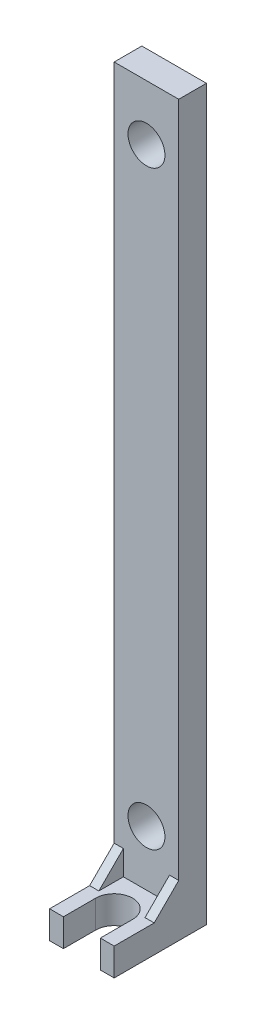
ISO-10303-21;
HEADER;
FILE_DESCRIPTION(('STEP AP214'),'2;1');
FILE_NAME('part.step','',(''),(''),'','','');
FILE_SCHEMA(('AUTOMOTIVE_DESIGN { 1 0 10303 214 1 1 1 1 }'));
ENDSEC;
DATA;
#1=APPLICATION_CONTEXT('core data for automotive mechanical design processes');
#2=APPLICATION_PROTOCOL_DEFINITION('international standard','automotive_design',2000,#1);
#3=PRODUCT_CONTEXT('',#1,'mechanical');
#4=PRODUCT('Part','Part','',(#3));
#5=PRODUCT_RELATED_PRODUCT_CATEGORY('part','',(#4));
#6=PRODUCT_DEFINITION_FORMATION('','',#4);
#7=PRODUCT_DEFINITION_CONTEXT('part definition',#1,'design');
#8=PRODUCT_DEFINITION('design','',#6,#7);
#9=PRODUCT_DEFINITION_SHAPE('','',#8);
#10=(LENGTH_UNIT() NAMED_UNIT(*) SI_UNIT(.MILLI.,.METRE.));
#11=(NAMED_UNIT(*) PLANE_ANGLE_UNIT() SI_UNIT($,.RADIAN.));
#12=(NAMED_UNIT(*) SI_UNIT($,.STERADIAN.) SOLID_ANGLE_UNIT());
#13=UNCERTAINTY_MEASURE_WITH_UNIT(LENGTH_MEASURE(1.E-05),#10,'distance_accuracy_value','');
#14=(GEOMETRIC_REPRESENTATION_CONTEXT(3) GLOBAL_UNCERTAINTY_ASSIGNED_CONTEXT((#13)) GLOBAL_UNIT_ASSIGNED_CONTEXT((#10,
#11,#12)) REPRESENTATION_CONTEXT('',''));
#15=CARTESIAN_POINT('',(0.,0.,0.));
#16=DIRECTION('',(0.,0.,1.));
#17=DIRECTION('',(1.,0.,0.));
#18=AXIS2_PLACEMENT_3D('',#15,#16,#17);
#19=CARTESIAN_POINT('',(0.,0.,3.));
#20=DIRECTION('',(0.,0.,1.));
#21=DIRECTION('',(1.,0.,0.));
#22=AXIS2_PLACEMENT_3D('',#19,#20,#21);
#23=PLANE('',#22);
#24=CARTESIAN_POINT('',(0.,33.5,3.));
#25=DIRECTION('',(0.,0.,1.));
#26=DIRECTION('',(1.,0.,0.));
#27=AXIS2_PLACEMENT_3D('',#24,#25,#26);
#28=CIRCLE('',#27,2.);
#29=CARTESIAN_POINT('',(2.,33.5,3.));
#30=VERTEX_POINT('',#29);
#31=EDGE_CURVE('E208',#30,#30,#28,.T.);
#32=ORIENTED_EDGE('',*,*,#31,.F.);
#33=EDGE_LOOP('',(#32));
#34=FACE_BOUND('',#33,.T.);
#35=CARTESIAN_POINT('',(0.,-30.5,3.));
#36=DIRECTION('',(0.,0.,1.));
#37=DIRECTION('',(1.,0.,0.));
#38=AXIS2_PLACEMENT_3D('',#35,#36,#37);
#39=CIRCLE('',#38,2.);
#40=CARTESIAN_POINT('',(2.,-30.5,3.));
#41=VERTEX_POINT('',#40);
#42=EDGE_CURVE('E232',#41,#41,#39,.T.);
#43=ORIENTED_EDGE('',*,*,#42,.F.);
#44=EDGE_LOOP('',(#43));
#45=FACE_BOUND('',#44,.T.);
#46=DIRECTION('',(0.,-1.,0.));
#47=VECTOR('',#46,1.);
#48=CARTESIAN_POINT('',(2.5,-33.8394874638918,3.));
#49=LINE('',#48,#47);
#50=CARTESIAN_POINT('',(2.5,-33.8394874638918,3.));
#51=VERTEX_POINT('',#50);
#52=CARTESIAN_POINT('',(2.5,-36.5,3.));
#53=VERTEX_POINT('',#52);
#54=EDGE_CURVE('E51',#51,#53,#49,.T.);
#55=ORIENTED_EDGE('',*,*,#54,.F.);
#56=DIRECTION('',(1.,0.,0.));
#57=VECTOR('',#56,1.);
#58=CARTESIAN_POINT('',(2.5,-33.8394874638918,3.));
#59=LINE('',#58,#57);
#60=CARTESIAN_POINT('',(3.5,-33.8394874638918,3.));
#61=VERTEX_POINT('',#60);
#62=EDGE_CURVE('E56',#51,#61,#59,.T.);
#63=ORIENTED_EDGE('',*,*,#62,.T.);
#64=DIRECTION('',(0.,1.,0.));
#65=VECTOR('',#64,1.);
#66=CARTESIAN_POINT('',(3.5,39.5,3.));
#67=LINE('',#66,#65);
#68=CARTESIAN_POINT('',(3.5,39.5,3.));
#69=VERTEX_POINT('',#68);
#70=EDGE_CURVE('E37',#61,#69,#67,.T.);
#71=ORIENTED_EDGE('',*,*,#70,.T.);
#72=DIRECTION('',(-1.,0.,0.));
#73=VECTOR('',#72,1.);
#74=CARTESIAN_POINT('',(-3.50000000000001,39.5,3.));
#75=LINE('',#74,#73);
#76=CARTESIAN_POINT('',(-3.50000000000001,39.5,3.));
#77=VERTEX_POINT('',#76);
#78=EDGE_CURVE('E223',#69,#77,#75,.T.);
#79=ORIENTED_EDGE('',*,*,#78,.T.);
#80=DIRECTION('',(0.,-1.,0.));
#81=VECTOR('',#80,1.);
#82=CARTESIAN_POINT('',(-3.50000000000001,39.5,3.));
#83=LINE('',#82,#81);
#84=CARTESIAN_POINT('',(-3.5,-33.8394874638918,3.));
#85=VERTEX_POINT('',#84);
#86=EDGE_CURVE('E220',#77,#85,#83,.T.);
#87=ORIENTED_EDGE('',*,*,#86,.T.);
#88=DIRECTION('',(-1.,0.,0.));
#89=VECTOR('',#88,1.);
#90=CARTESIAN_POINT('',(-2.5,-33.8394874638918,3.));
#91=LINE('',#90,#89);
#92=CARTESIAN_POINT('',(-2.5,-33.8394874638918,3.));
#93=VERTEX_POINT('',#92);
#94=EDGE_CURVE('E155',#93,#85,#91,.T.);
#95=ORIENTED_EDGE('',*,*,#94,.F.);
#96=DIRECTION('',(0.,-1.,0.));
#97=VECTOR('',#96,1.);
#98=CARTESIAN_POINT('',(-2.5,-33.8394874638918,3.));
#99=LINE('',#98,#97);
#100=CARTESIAN_POINT('',(-2.5,-36.5,3.));
#101=VERTEX_POINT('',#100);
#102=EDGE_CURVE('E149',#93,#101,#99,.T.);
#103=ORIENTED_EDGE('',*,*,#102,.T.);
#104=DIRECTION('',(-1.,0.,0.));
#105=VECTOR('',#104,1.);
#106=CARTESIAN_POINT('',(-3.50000000000001,-36.5,3.));
#107=LINE('',#106,#105);
#108=EDGE_CURVE('E136',#53,#101,#107,.T.);
#109=ORIENTED_EDGE('',*,*,#108,.F.);
#110=EDGE_LOOP('',(#55,#63,#71,#79,#87,#95,#103,#109));
#111=FACE_BOUND('',#110,.T.);
#112=ADVANCED_FACE('F33',(#34,#45,#111),#23,.T.);
#113=CARTESIAN_POINT('',(-3.50000000000001,-36.5,10.));
#114=DIRECTION('',(0.,-1.,0.));
#115=DIRECTION('',(0.,0.,-1.));
#116=AXIS2_PLACEMENT_3D('',#113,#114,#115);
#117=PLANE('',#116);
#118=DIRECTION('',(1.,0.,0.));
#119=VECTOR('',#118,1.);
#120=CARTESIAN_POINT('',(2.5,-36.5,5.66051253610824));
#121=LINE('',#120,#119);
#122=CARTESIAN_POINT('',(2.5,-36.5,5.66051253610824));
#123=VERTEX_POINT('',#122);
#124=CARTESIAN_POINT('',(3.50000000000001,-36.5,5.66051253610824));
#125=VERTEX_POINT('',#124);
#126=EDGE_CURVE('E159',#123,#125,#121,.T.);
#127=ORIENTED_EDGE('',*,*,#126,.F.);
#128=DIRECTION('',(0.,0.,1.));
#129=VECTOR('',#128,1.);
#130=CARTESIAN_POINT('',(2.5,-36.5,3.));
#131=LINE('',#130,#129);
#132=EDGE_CURVE('E142',#53,#123,#131,.T.);
#133=ORIENTED_EDGE('',*,*,#132,.F.);
#134=ORIENTED_EDGE('',*,*,#108,.T.);
#135=DIRECTION('',(0.,0.,1.));
#136=VECTOR('',#135,1.);
#137=CARTESIAN_POINT('',(-2.5,-36.5,3.));
#138=LINE('',#137,#136);
#139=CARTESIAN_POINT('',(-2.5,-36.5,5.66051253610824));
#140=VERTEX_POINT('',#139);
#141=EDGE_CURVE('E140',#101,#140,#138,.T.);
#142=ORIENTED_EDGE('',*,*,#141,.T.);
#143=DIRECTION('',(-1.,0.,0.));
#144=VECTOR('',#143,1.);
#145=CARTESIAN_POINT('',(-2.5,-36.5,5.66051253610824));
#146=LINE('',#145,#144);
#147=CARTESIAN_POINT('',(-3.5,-36.5,5.66051253610824));
#148=VERTEX_POINT('',#147);
#149=EDGE_CURVE('E164',#140,#148,#146,.T.);
#150=ORIENTED_EDGE('',*,*,#149,.T.);
#151=DIRECTION('',(0.,0.,-1.));
#152=VECTOR('',#151,1.);
#153=CARTESIAN_POINT('',(-3.50000000000001,-36.5,10.));
#154=LINE('',#153,#152);
#155=CARTESIAN_POINT('',(-3.50000000000001,-36.5,10.));
#156=VERTEX_POINT('',#155);
#157=EDGE_CURVE('E205',#156,#148,#154,.T.);
#158=ORIENTED_EDGE('',*,*,#157,.F.);
#159=DIRECTION('',(-1.,0.,0.));
#160=VECTOR('',#159,1.);
#161=CARTESIAN_POINT('',(-3.50000000000001,-36.5,10.));
#162=LINE('',#161,#160);
#163=CARTESIAN_POINT('',(-2.,-36.5,10.));
#164=VERTEX_POINT('',#163);
#165=EDGE_CURVE('E194',#164,#156,#162,.T.);
#166=ORIENTED_EDGE('',*,*,#165,.F.);
#167=DIRECTION('',(0.,0.,1.));
#168=VECTOR('',#167,1.);
#169=CARTESIAN_POINT('',(-2.,-36.5,6.5));
#170=LINE('',#169,#168);
#171=CARTESIAN_POINT('',(-2.,-36.5,6.5));
#172=VERTEX_POINT('',#171);
#173=EDGE_CURVE('E171',#172,#164,#170,.T.);
#174=ORIENTED_EDGE('',*,*,#173,.F.);
#175=CARTESIAN_POINT('',(0.,-36.5,6.5));
#176=DIRECTION('',(0.,-1.,0.));
#177=DIRECTION('',(0.,0.,-1.));
#178=AXIS2_PLACEMENT_3D('',#175,#176,#177);
#179=CIRCLE('',#178,2.);
#180=CARTESIAN_POINT('',(2.,-36.5,6.5));
#181=VERTEX_POINT('',#180);
#182=EDGE_CURVE('E167',#181,#172,#179,.F.);
#183=ORIENTED_EDGE('',*,*,#182,.F.);
#184=DIRECTION('',(0.,0.,-1.));
#185=VECTOR('',#184,1.);
#186=CARTESIAN_POINT('',(2.,-36.5,6.5));
#187=LINE('',#186,#185);
#188=CARTESIAN_POINT('',(2.,-36.5,10.));
#189=VERTEX_POINT('',#188);
#190=EDGE_CURVE('E145',#189,#181,#187,.T.);
#191=ORIENTED_EDGE('',*,*,#190,.F.);
#192=CARTESIAN_POINT('',(3.50000000000001,-36.5,10.));
#193=VERTEX_POINT('',#192);
#194=EDGE_CURVE('E195',#193,#189,#162,.T.);
#195=ORIENTED_EDGE('',*,*,#194,.F.);
#196=DIRECTION('',(0.,0.,-1.));
#197=VECTOR('',#196,1.);
#198=CARTESIAN_POINT('',(3.50000000000001,-36.5,10.));
#199=LINE('',#198,#197);
#200=EDGE_CURVE('E213',#193,#125,#199,.T.);
#201=ORIENTED_EDGE('',*,*,#200,.T.);
#202=EDGE_LOOP('',(#127,#133,#134,#142,#150,#158,#166,#174,#183,#191,#195,#201));
#203=FACE_BOUND('',#202,.T.);
#204=ADVANCED_FACE('F138',(#203),#117,.F.);
#205=CARTESIAN_POINT('',(0.,0.,10.));
#206=DIRECTION('',(0.,0.,1.));
#207=DIRECTION('',(1.,0.,0.));
#208=AXIS2_PLACEMENT_3D('',#205,#206,#207);
#209=PLANE('',#208);
#210=DIRECTION('',(0.,-1.,0.));
#211=VECTOR('',#210,1.);
#212=CARTESIAN_POINT('',(-2.,39.501025,10.));
#213=LINE('',#212,#211);
#214=CARTESIAN_POINT('',(-2.,-39.5,10.));
#215=VERTEX_POINT('',#214);
#216=EDGE_CURVE('E184',#164,#215,#213,.T.);
#217=ORIENTED_EDGE('',*,*,#216,.F.);
#218=ORIENTED_EDGE('',*,*,#165,.T.);
#219=DIRECTION('',(0.,-1.,0.));
#220=VECTOR('',#219,1.);
#221=CARTESIAN_POINT('',(-3.50000000000001,-36.5,10.));
#222=LINE('',#221,#220);
#223=CARTESIAN_POINT('',(-3.50000000000001,-39.5,10.));
#224=VERTEX_POINT('',#223);
#225=EDGE_CURVE('E198',#156,#224,#222,.T.);
#226=ORIENTED_EDGE('',*,*,#225,.T.);
#227=DIRECTION('',(1.,0.,0.));
#228=VECTOR('',#227,1.);
#229=CARTESIAN_POINT('',(-3.50000000000001,-39.5,10.));
#230=LINE('',#229,#228);
#231=EDGE_CURVE('E202',#224,#215,#230,.T.);
#232=ORIENTED_EDGE('',*,*,#231,.T.);
#233=EDGE_LOOP('',(#217,#218,#226,#232));
#234=FACE_BOUND('',#233,.T.);
#235=ADVANCED_FACE('F281',(#234),#209,.T.);
#236=CARTESIAN_POINT('',(0.,0.,0.));
#237=DIRECTION('',(0.,0.,1.));
#238=DIRECTION('',(1.,0.,0.));
#239=AXIS2_PLACEMENT_3D('',#236,#237,#238);
#240=PLANE('',#239);
#241=CARTESIAN_POINT('',(0.,-30.5,0.));
#242=DIRECTION('',(0.,0.,1.));
#243=DIRECTION('',(1.,0.,0.));
#244=AXIS2_PLACEMENT_3D('',#241,#242,#243);
#245=CIRCLE('',#244,2.);
#246=CARTESIAN_POINT('',(2.,-30.5,0.));
#247=VERTEX_POINT('',#246);
#248=EDGE_CURVE('E462',#247,#247,#245,.T.);
#249=ORIENTED_EDGE('',*,*,#248,.T.);
#250=EDGE_LOOP('',(#249));
#251=FACE_BOUND('',#250,.T.);
#252=DIRECTION('',(0.,1.,0.));
#253=VECTOR('',#252,1.);
#254=CARTESIAN_POINT('',(3.5,39.5,0.));
#255=LINE('',#254,#253);
#256=CARTESIAN_POINT('',(3.50000000000001,-39.5,0.));
#257=VERTEX_POINT('',#256);
#258=CARTESIAN_POINT('',(3.5,39.5,0.));
#259=VERTEX_POINT('',#258);
#260=EDGE_CURVE('E228',#257,#259,#255,.T.);
#261=ORIENTED_EDGE('',*,*,#260,.F.);
#262=DIRECTION('',(1.,0.,0.));
#263=VECTOR('',#262,1.);
#264=CARTESIAN_POINT('',(-3.5,-39.5,0.));
#265=LINE('',#264,#263);
#266=CARTESIAN_POINT('',(-3.5,-39.5,0.));
#267=VERTEX_POINT('',#266);
#268=EDGE_CURVE('E236',#267,#257,#265,.T.);
#269=ORIENTED_EDGE('',*,*,#268,.F.);
#270=DIRECTION('',(0.,-1.,0.));
#271=VECTOR('',#270,1.);
#272=CARTESIAN_POINT('',(-3.50000000000001,39.5,0.));
#273=LINE('',#272,#271);
#274=CARTESIAN_POINT('',(-3.50000000000001,39.5,0.));
#275=VERTEX_POINT('',#274);
#276=EDGE_CURVE('E234',#275,#267,#273,.T.);
#277=ORIENTED_EDGE('',*,*,#276,.F.);
#278=DIRECTION('',(-1.,0.,0.));
#279=VECTOR('',#278,1.);
#280=CARTESIAN_POINT('',(-3.50000000000001,39.5,0.));
#281=LINE('',#280,#279);
#282=EDGE_CURVE('E231',#259,#275,#281,.T.);
#283=ORIENTED_EDGE('',*,*,#282,.F.);
#284=EDGE_LOOP('',(#261,#269,#277,#283));
#285=FACE_BOUND('',#284,.T.);
#286=CARTESIAN_POINT('',(0.,33.5,0.));
#287=DIRECTION('',(0.,0.,1.));
#288=DIRECTION('',(1.,0.,0.));
#289=AXIS2_PLACEMENT_3D('',#286,#287,#288);
#290=CIRCLE('',#289,2.);
#291=CARTESIAN_POINT('',(2.,33.5,0.));
#292=VERTEX_POINT('',#291);
#293=EDGE_CURVE('E215',#292,#292,#290,.T.);
#294=ORIENTED_EDGE('',*,*,#293,.T.);
#295=EDGE_LOOP('',(#294));
#296=FACE_BOUND('',#295,.T.);
#297=ADVANCED_FACE('F253',(#251,#285,#296),#240,.F.);
#298=CARTESIAN_POINT('',(3.5,39.5,3.));
#299=DIRECTION('',(-1.,0.,0.));
#300=DIRECTION('',(0.,-1.,0.));
#301=AXIS2_PLACEMENT_3D('',#298,#299,#300);
#302=PLANE('',#301);
#303=ORIENTED_EDGE('',*,*,#70,.F.);
#304=DIRECTION('',(0.,0.707106781186539,-0.707106781186556));
#305=VECTOR('',#304,1.);
#306=CARTESIAN_POINT('',(3.5,-33.8394874638918,3.));
#307=LINE('',#306,#305);
#308=EDGE_CURVE('E322',#125,#61,#307,.T.);
#309=ORIENTED_EDGE('',*,*,#308,.F.);
#310=ORIENTED_EDGE('',*,*,#200,.F.);
#311=DIRECTION('',(0.,1.,0.));
#312=VECTOR('',#311,1.);
#313=CARTESIAN_POINT('',(3.50000000000001,-36.5,10.));
#314=LINE('',#313,#312);
#315=CARTESIAN_POINT('',(3.50000000000001,-39.5,10.));
#316=VERTEX_POINT('',#315);
#317=EDGE_CURVE('E144',#316,#193,#314,.T.);
#318=ORIENTED_EDGE('',*,*,#317,.F.);
#319=DIRECTION('',(0.,0.,-1.));
#320=VECTOR('',#319,1.);
#321=CARTESIAN_POINT('',(3.50000000000001,-39.5,3.));
#322=LINE('',#321,#320);
#323=EDGE_CURVE('E222',#316,#257,#322,.T.);
#324=ORIENTED_EDGE('',*,*,#323,.T.);
#325=ORIENTED_EDGE('',*,*,#260,.T.);
#326=DIRECTION('',(0.,0.,-1.));
#327=VECTOR('',#326,1.);
#328=CARTESIAN_POINT('',(3.5,39.5,3.));
#329=LINE('',#328,#327);
#330=EDGE_CURVE('E11',#69,#259,#329,.T.);
#331=ORIENTED_EDGE('',*,*,#330,.F.);
#332=EDGE_LOOP('',(#303,#309,#310,#318,#324,#325,#331));
#333=FACE_BOUND('',#332,.T.);
#334=ADVANCED_FACE('F35',(#333),#302,.F.);
#335=CARTESIAN_POINT('',(-3.50000000000001,39.5,3.));
#336=DIRECTION('',(0.,-1.,0.));
#337=DIRECTION('',(0.,0.,-1.));
#338=AXIS2_PLACEMENT_3D('',#335,#336,#337);
#339=PLANE('',#338);
#340=ORIENTED_EDGE('',*,*,#282,.T.);
#341=DIRECTION('',(0.,0.,-1.));
#342=VECTOR('',#341,1.);
#343=CARTESIAN_POINT('',(-3.50000000000001,39.5,3.));
#344=LINE('',#343,#342);
#345=EDGE_CURVE('E43',#77,#275,#344,.T.);
#346=ORIENTED_EDGE('',*,*,#345,.F.);
#347=ORIENTED_EDGE('',*,*,#78,.F.);
#348=ORIENTED_EDGE('',*,*,#330,.T.);
#349=EDGE_LOOP('',(#340,#346,#347,#348));
#350=FACE_BOUND('',#349,.T.);
#351=ADVANCED_FACE('F316',(#350),#339,.F.);
#352=CARTESIAN_POINT('',(-3.50000000000001,39.5,3.));
#353=DIRECTION('',(1.,0.,0.));
#354=DIRECTION('',(0.,1.,0.));
#355=AXIS2_PLACEMENT_3D('',#352,#353,#354);
#356=PLANE('',#355);
#357=ORIENTED_EDGE('',*,*,#276,.T.);
#358=DIRECTION('',(0.,0.,-1.));
#359=VECTOR('',#358,1.);
#360=CARTESIAN_POINT('',(-3.5,-39.5,3.));
#361=LINE('',#360,#359);
#362=EDGE_CURVE('E240',#224,#267,#361,.T.);
#363=ORIENTED_EDGE('',*,*,#362,.F.);
#364=ORIENTED_EDGE('',*,*,#225,.F.);
#365=ORIENTED_EDGE('',*,*,#157,.T.);
#366=DIRECTION('',(0.,0.707106781186539,-0.707106781186556));
#367=VECTOR('',#366,1.);
#368=CARTESIAN_POINT('',(-3.5,-33.8394874638918,3.));
#369=LINE('',#368,#367);
#370=EDGE_CURVE('E156',#148,#85,#369,.T.);
#371=ORIENTED_EDGE('',*,*,#370,.T.);
#372=ORIENTED_EDGE('',*,*,#86,.F.);
#373=ORIENTED_EDGE('',*,*,#345,.T.);
#374=EDGE_LOOP('',(#357,#363,#364,#365,#371,#372,#373));
#375=FACE_BOUND('',#374,.T.);
#376=ADVANCED_FACE('F247',(#375),#356,.F.);
#377=CARTESIAN_POINT('',(-3.5,-39.5,3.));
#378=DIRECTION('',(0.,1.,0.));
#379=DIRECTION('',(0.,0.,1.));
#380=AXIS2_PLACEMENT_3D('',#377,#378,#379);
#381=PLANE('',#380);
#382=CARTESIAN_POINT('',(0.,-39.5,6.5));
#383=DIRECTION('',(0.,-1.,0.));
#384=DIRECTION('',(0.,0.,-1.));
#385=AXIS2_PLACEMENT_3D('',#382,#383,#384);
#386=CIRCLE('',#385,2.);
#387=CARTESIAN_POINT('',(-2.,-39.5,6.5));
#388=VERTEX_POINT('',#387);
#389=CARTESIAN_POINT('',(2.,-39.5,6.5));
#390=VERTEX_POINT('',#389);
#391=EDGE_CURVE('E173',#388,#390,#386,.T.);
#392=ORIENTED_EDGE('',*,*,#391,.F.);
#393=DIRECTION('',(0.,0.,-1.));
#394=VECTOR('',#393,1.);
#395=CARTESIAN_POINT('',(-2.,-39.5,6.5));
#396=LINE('',#395,#394);
#397=EDGE_CURVE('E178',#215,#388,#396,.T.);
#398=ORIENTED_EDGE('',*,*,#397,.F.);
#399=ORIENTED_EDGE('',*,*,#231,.F.);
#400=ORIENTED_EDGE('',*,*,#362,.T.);
#401=ORIENTED_EDGE('',*,*,#268,.T.);
#402=ORIENTED_EDGE('',*,*,#323,.F.);
#403=CARTESIAN_POINT('',(2.,-39.5,10.));
#404=VERTEX_POINT('',#403);
#405=EDGE_CURVE('E201',#404,#316,#230,.T.);
#406=ORIENTED_EDGE('',*,*,#405,.F.);
#407=DIRECTION('',(0.,0.,1.));
#408=VECTOR('',#407,1.);
#409=CARTESIAN_POINT('',(2.,-39.5,6.5));
#410=LINE('',#409,#408);
#411=EDGE_CURVE('E176',#390,#404,#410,.T.);
#412=ORIENTED_EDGE('',*,*,#411,.F.);
#413=EDGE_LOOP('',(#392,#398,#399,#400,#401,#402,#406,#412));
#414=FACE_BOUND('',#413,.T.);
#415=ADVANCED_FACE('F258',(#414),#381,.F.);
#416=CARTESIAN_POINT('',(0.,-30.5,3.));
#417=DIRECTION('',(0.,0.,-1.));
#418=DIRECTION('',(-1.,0.,0.));
#419=AXIS2_PLACEMENT_3D('',#416,#417,#418);
#420=CYLINDRICAL_SURFACE('',#419,2.);
#421=ORIENTED_EDGE('',*,*,#42,.T.);
#422=EDGE_LOOP('',(#421));
#423=FACE_BOUND('',#422,.T.);
#424=ORIENTED_EDGE('',*,*,#248,.F.);
#425=EDGE_LOOP('',(#424));
#426=FACE_BOUND('',#425,.T.);
#427=ADVANCED_FACE('F308',(#423,#426),#420,.F.);
#428=CARTESIAN_POINT('',(0.,33.5,3.));
#429=DIRECTION('',(0.,0.,-1.));
#430=DIRECTION('',(-1.,0.,0.));
#431=AXIS2_PLACEMENT_3D('',#428,#429,#430);
#432=CYLINDRICAL_SURFACE('',#431,2.);
#433=ORIENTED_EDGE('',*,*,#31,.T.);
#434=EDGE_LOOP('',(#433));
#435=FACE_BOUND('',#434,.T.);
#436=ORIENTED_EDGE('',*,*,#293,.F.);
#437=EDGE_LOOP('',(#436));
#438=FACE_BOUND('',#437,.T.);
#439=ADVANCED_FACE('F385',(#435,#438),#432,.F.);
#440=DIRECTION('',(0.,-1.,0.));
#441=VECTOR('',#440,1.);
#442=CARTESIAN_POINT('',(2.,39.501025,10.));
#443=LINE('',#442,#441);
#444=EDGE_CURVE('E186',#189,#404,#443,.T.);
#445=ORIENTED_EDGE('',*,*,#444,.T.);
#446=ORIENTED_EDGE('',*,*,#405,.T.);
#447=ORIENTED_EDGE('',*,*,#317,.T.);
#448=ORIENTED_EDGE('',*,*,#194,.T.);
#449=EDGE_LOOP('',(#445,#446,#447,#448));
#450=FACE_BOUND('',#449,.T.);
#451=ADVANCED_FACE('F267',(#450),#209,.T.);
#452=CARTESIAN_POINT('',(0.,39.501025,6.5));
#453=DIRECTION('',(0.,-1.,0.));
#454=DIRECTION('',(0.,0.,-1.));
#455=AXIS2_PLACEMENT_3D('',#452,#453,#454);
#456=CYLINDRICAL_SURFACE('',#455,2.);
#457=ORIENTED_EDGE('',*,*,#182,.T.);
#458=DIRECTION('',(0.,-1.,0.));
#459=VECTOR('',#458,1.);
#460=CARTESIAN_POINT('',(-2.,39.501025,6.5));
#461=LINE('',#460,#459);
#462=EDGE_CURVE('E182',#172,#388,#461,.T.);
#463=ORIENTED_EDGE('',*,*,#462,.T.);
#464=ORIENTED_EDGE('',*,*,#391,.T.);
#465=DIRECTION('',(0.,-1.,0.));
#466=VECTOR('',#465,1.);
#467=CARTESIAN_POINT('',(2.,39.501025,6.5));
#468=LINE('',#467,#466);
#469=EDGE_CURVE('E181',#181,#390,#468,.T.);
#470=ORIENTED_EDGE('',*,*,#469,.F.);
#471=EDGE_LOOP('',(#457,#463,#464,#470));
#472=FACE_BOUND('',#471,.T.);
#473=ADVANCED_FACE('F275',(#472),#456,.F.);
#474=CARTESIAN_POINT('',(-2.,39.501025,6.5));
#475=DIRECTION('',(-1.,0.,0.));
#476=DIRECTION('',(0.,0.,1.));
#477=AXIS2_PLACEMENT_3D('',#474,#475,#476);
#478=PLANE('',#477);
#479=ORIENTED_EDGE('',*,*,#173,.T.);
#480=ORIENTED_EDGE('',*,*,#216,.T.);
#481=ORIENTED_EDGE('',*,*,#397,.T.);
#482=ORIENTED_EDGE('',*,*,#462,.F.);
#483=EDGE_LOOP('',(#479,#480,#481,#482));
#484=FACE_BOUND('',#483,.T.);
#485=ADVANCED_FACE('F278',(#484),#478,.F.);
#486=CARTESIAN_POINT('',(2.,39.501025,6.5));
#487=DIRECTION('',(1.,0.,0.));
#488=DIRECTION('',(0.,0.,-1.));
#489=AXIS2_PLACEMENT_3D('',#486,#487,#488);
#490=PLANE('',#489);
#491=ORIENTED_EDGE('',*,*,#190,.T.);
#492=ORIENTED_EDGE('',*,*,#469,.T.);
#493=ORIENTED_EDGE('',*,*,#411,.T.);
#494=ORIENTED_EDGE('',*,*,#444,.F.);
#495=EDGE_LOOP('',(#491,#492,#493,#494));
#496=FACE_BOUND('',#495,.T.);
#497=ADVANCED_FACE('F271',(#496),#490,.F.);
#498=CARTESIAN_POINT('',(-2.5,-33.8394874638918,3.));
#499=DIRECTION('',(0.,0.707106781186556,0.707106781186539));
#500=DIRECTION('',(0.,-0.707106781186539,0.707106781186556));
#501=AXIS2_PLACEMENT_3D('',#498,#499,#500);
#502=PLANE('',#501);
#503=ORIENTED_EDGE('',*,*,#370,.F.);
#504=ORIENTED_EDGE('',*,*,#149,.F.);
#505=DIRECTION('',(0.,0.707106781186539,-0.707106781186556));
#506=VECTOR('',#505,1.);
#507=CARTESIAN_POINT('',(-2.5,-33.8394874638918,3.));
#508=LINE('',#507,#506);
#509=EDGE_CURVE('E151',#140,#93,#508,.T.);
#510=ORIENTED_EDGE('',*,*,#509,.T.);
#511=ORIENTED_EDGE('',*,*,#94,.T.);
#512=EDGE_LOOP('',(#503,#504,#510,#511));
#513=FACE_BOUND('',#512,.T.);
#514=ADVANCED_FACE('F286',(#513),#502,.T.);
#515=CARTESIAN_POINT('',(-2.5,0.,0.));
#516=DIRECTION('',(-1.,0.,0.));
#517=DIRECTION('',(0.,-1.,0.));
#518=AXIS2_PLACEMENT_3D('',#515,#516,#517);
#519=PLANE('',#518);
#520=ORIENTED_EDGE('',*,*,#102,.F.);
#521=ORIENTED_EDGE('',*,*,#509,.F.);
#522=ORIENTED_EDGE('',*,*,#141,.F.);
#523=EDGE_LOOP('',(#520,#521,#522));
#524=FACE_BOUND('',#523,.T.);
#525=ADVANCED_FACE('F148',(#524),#519,.F.);
#526=CARTESIAN_POINT('',(2.5,-33.8394874638918,3.));
#527=DIRECTION('',(0.,-0.707106781186556,-0.707106781186539));
#528=DIRECTION('',(0.,0.707106781186539,-0.707106781186556));
#529=AXIS2_PLACEMENT_3D('',#526,#527,#528);
#530=PLANE('',#529);
#531=ORIENTED_EDGE('',*,*,#308,.T.);
#532=ORIENTED_EDGE('',*,*,#62,.F.);
#533=DIRECTION('',(0.,0.707106781186539,-0.707106781186556));
#534=VECTOR('',#533,1.);
#535=CARTESIAN_POINT('',(2.5,-33.8394874638918,3.));
#536=LINE('',#535,#534);
#537=EDGE_CURVE('E327',#123,#51,#536,.T.);
#538=ORIENTED_EDGE('',*,*,#537,.F.);
#539=ORIENTED_EDGE('',*,*,#126,.T.);
#540=EDGE_LOOP('',(#531,#532,#538,#539));
#541=FACE_BOUND('',#540,.T.);
#542=ADVANCED_FACE('F293',(#541),#530,.F.);
#543=CARTESIAN_POINT('',(2.5,0.,0.));
#544=DIRECTION('',(1.,0.,0.));
#545=DIRECTION('',(0.,-1.,0.));
#546=AXIS2_PLACEMENT_3D('',#543,#544,#545);
#547=PLANE('',#546);
#548=ORIENTED_EDGE('',*,*,#54,.T.);
#549=ORIENTED_EDGE('',*,*,#132,.T.);
#550=ORIENTED_EDGE('',*,*,#537,.T.);
#551=EDGE_LOOP('',(#548,#549,#550));
#552=FACE_BOUND('',#551,.T.);
#553=ADVANCED_FACE('F332',(#552),#547,.F.);
#554=CLOSED_SHELL('',(#112,#204,#235,#297,#334,#351,#376,#415,#427,#439,#451,#473,#485,#497,
#514,#525,#542,#553));
#555=MANIFOLD_SOLID_BREP('B2',#554);
#556=ADVANCED_BREP_SHAPE_REPRESENTATION('',(#18,#555),#14);
#557=SHAPE_DEFINITION_REPRESENTATION(#9,#556);
ENDSEC;
END-ISO-10303-21;
